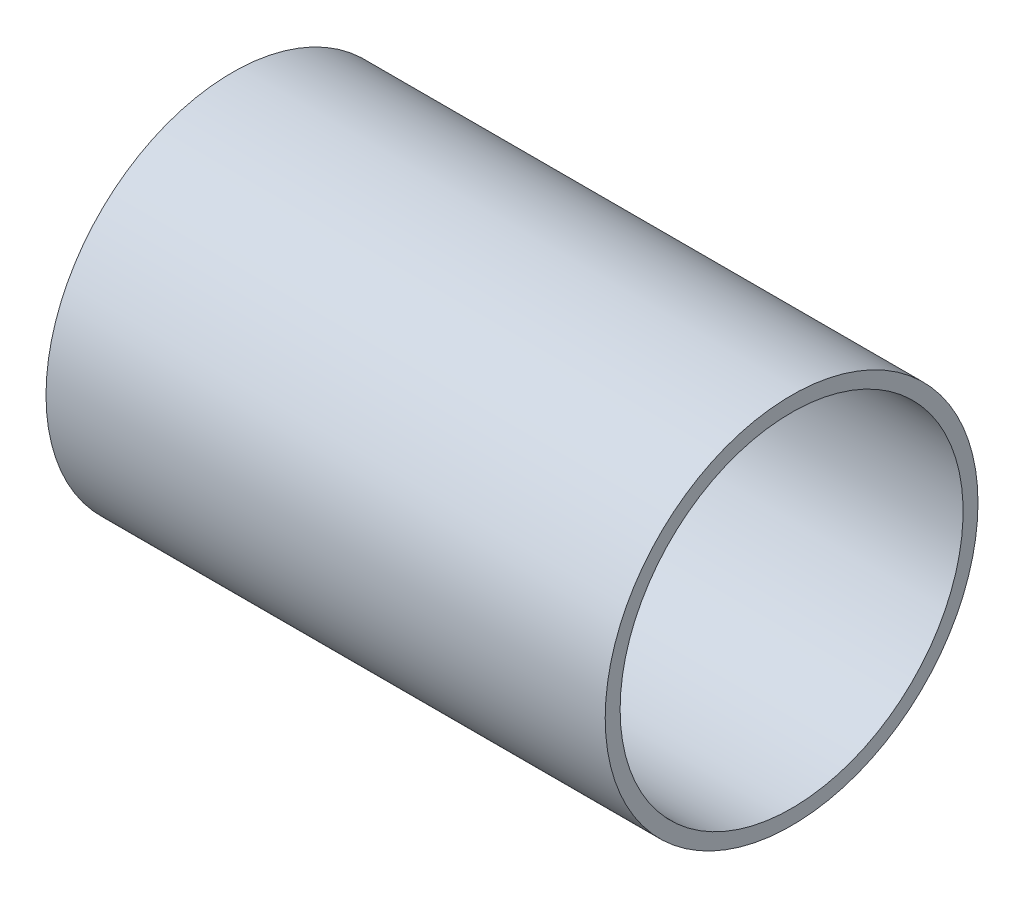
ISO-10303-21;
HEADER;
FILE_DESCRIPTION(('STEP AP214'),'2;1');
FILE_NAME('part.step','',(''),(''),'','','');
FILE_SCHEMA(('AUTOMOTIVE_DESIGN { 1 0 10303 214 1 1 1 1 }'));
ENDSEC;
DATA;
#1=APPLICATION_CONTEXT('core data for automotive mechanical design processes');
#2=APPLICATION_PROTOCOL_DEFINITION('international standard','automotive_design',2000,#1);
#3=PRODUCT_CONTEXT('',#1,'mechanical');
#4=PRODUCT('Part','Part','',(#3));
#5=PRODUCT_RELATED_PRODUCT_CATEGORY('part','',(#4));
#6=PRODUCT_DEFINITION_FORMATION('','',#4);
#7=PRODUCT_DEFINITION_CONTEXT('part definition',#1,'design');
#8=PRODUCT_DEFINITION('design','',#6,#7);
#9=PRODUCT_DEFINITION_SHAPE('','',#8);
#10=(LENGTH_UNIT() NAMED_UNIT(*) SI_UNIT(.MILLI.,.METRE.));
#11=(NAMED_UNIT(*) PLANE_ANGLE_UNIT() SI_UNIT($,.RADIAN.));
#12=(NAMED_UNIT(*) SI_UNIT($,.STERADIAN.) SOLID_ANGLE_UNIT());
#13=UNCERTAINTY_MEASURE_WITH_UNIT(LENGTH_MEASURE(1.E-05),#10,'distance_accuracy_value','');
#14=(GEOMETRIC_REPRESENTATION_CONTEXT(3) GLOBAL_UNCERTAINTY_ASSIGNED_CONTEXT((#13)) GLOBAL_UNIT_ASSIGNED_CONTEXT((#10,
#11,#12)) REPRESENTATION_CONTEXT('',''));
#15=CARTESIAN_POINT('',(0.,0.,0.));
#16=DIRECTION('',(0.,0.,1.));
#17=DIRECTION('',(1.,0.,0.));
#18=AXIS2_PLACEMENT_3D('',#15,#16,#17);
#19=CARTESIAN_POINT('',(45.,0.,0.));
#20=DIRECTION('',(1.,0.,0.));
#21=DIRECTION('',(0.,0.,-1.));
#22=AXIS2_PLACEMENT_3D('',#19,#20,#21);
#23=PLANE('',#22);
#24=CARTESIAN_POINT('',(45.,0.,0.));
#25=DIRECTION('',(1.,0.,0.));
#26=DIRECTION('',(0.,0.,-1.));
#27=AXIS2_PLACEMENT_3D('',#24,#25,#26);
#28=CIRCLE('',#27,15.);
#29=CARTESIAN_POINT('',(45.,0.,15.));
#30=VERTEX_POINT('',#29);
#31=EDGE_CURVE('E10',#30,#30,#28,.T.);
#32=ORIENTED_EDGE('',*,*,#31,.T.);
#33=EDGE_LOOP('',(#32));
#34=FACE_BOUND('',#33,.T.);
#35=CARTESIAN_POINT('',(45.,0.,0.));
#36=DIRECTION('',(1.,0.,0.));
#37=DIRECTION('',(0.,0.,-1.));
#38=AXIS2_PLACEMENT_3D('',#35,#36,#37);
#39=CIRCLE('',#38,13.8);
#40=CARTESIAN_POINT('',(45.,0.,13.8));
#41=VERTEX_POINT('',#40);
#42=EDGE_CURVE('E45',#41,#41,#39,.T.);
#43=ORIENTED_EDGE('',*,*,#42,.F.);
#44=EDGE_LOOP('',(#43));
#45=FACE_BOUND('',#44,.T.);
#46=ADVANCED_FACE('F34',(#34,#45),#23,.T.);
#47=CARTESIAN_POINT('',(0.,0.,0.));
#48=DIRECTION('',(1.,0.,0.));
#49=DIRECTION('',(0.,0.,-1.));
#50=AXIS2_PLACEMENT_3D('',#47,#48,#49);
#51=PLANE('',#50);
#52=CARTESIAN_POINT('',(0.,0.,0.));
#53=DIRECTION('',(1.,0.,0.));
#54=DIRECTION('',(0.,0.,-1.));
#55=AXIS2_PLACEMENT_3D('',#52,#53,#54);
#56=CIRCLE('',#55,15.);
#57=CARTESIAN_POINT('',(0.,0.,15.));
#58=VERTEX_POINT('',#57);
#59=EDGE_CURVE('E38',#58,#58,#56,.T.);
#60=ORIENTED_EDGE('',*,*,#59,.F.);
#61=EDGE_LOOP('',(#60));
#62=FACE_BOUND('',#61,.T.);
#63=CARTESIAN_POINT('',(0.,0.,0.));
#64=DIRECTION('',(1.,0.,0.));
#65=DIRECTION('',(0.,0.,-1.));
#66=AXIS2_PLACEMENT_3D('',#63,#64,#65);
#67=CIRCLE('',#66,13.8);
#68=CARTESIAN_POINT('',(0.,0.,13.8));
#69=VERTEX_POINT('',#68);
#70=EDGE_CURVE('E47',#69,#69,#67,.T.);
#71=ORIENTED_EDGE('',*,*,#70,.T.);
#72=EDGE_LOOP('',(#71));
#73=FACE_BOUND('',#72,.T.);
#74=ADVANCED_FACE('F57',(#62,#73),#51,.F.);
#75=CARTESIAN_POINT('',(45.,0.,0.));
#76=DIRECTION('',(-1.,0.,0.));
#77=DIRECTION('',(0.,0.,1.));
#78=AXIS2_PLACEMENT_3D('',#75,#76,#77);
#79=CYLINDRICAL_SURFACE('',#78,15.);
#80=CARTESIAN_POINT('',(45.,0.,15.));
#81=CARTESIAN_POINT('',(44.53125,0.,15.));
#82=CARTESIAN_POINT('',(44.0625,0.,15.));
#83=CARTESIAN_POINT('',(43.125,0.,15.));
#84=CARTESIAN_POINT('',(42.65625,0.,15.));
#85=CARTESIAN_POINT('',(41.71875,0.,15.));
#86=CARTESIAN_POINT('',(41.25,0.,15.));
#87=CARTESIAN_POINT('',(40.3125,0.,15.));
#88=CARTESIAN_POINT('',(39.84375,0.,15.));
#89=CARTESIAN_POINT('',(38.90625,0.,15.));
#90=CARTESIAN_POINT('',(38.4375,0.,15.));
#91=CARTESIAN_POINT('',(37.5,0.,15.));
#92=CARTESIAN_POINT('',(37.03125,0.,15.));
#93=CARTESIAN_POINT('',(36.09375,0.,15.));
#94=CARTESIAN_POINT('',(35.625,0.,15.));
#95=CARTESIAN_POINT('',(34.6875,0.,15.));
#96=CARTESIAN_POINT('',(34.21875,0.,15.));
#97=CARTESIAN_POINT('',(33.28125,0.,15.));
#98=CARTESIAN_POINT('',(32.8125,0.,15.));
#99=CARTESIAN_POINT('',(31.875,0.,15.));
#100=CARTESIAN_POINT('',(31.40625,0.,15.));
#101=CARTESIAN_POINT('',(30.46875,0.,15.));
#102=CARTESIAN_POINT('',(30.,0.,15.));
#103=CARTESIAN_POINT('',(29.0625,0.,15.));
#104=CARTESIAN_POINT('',(28.59375,0.,15.));
#105=CARTESIAN_POINT('',(27.65625,0.,15.));
#106=CARTESIAN_POINT('',(27.1875,0.,15.));
#107=CARTESIAN_POINT('',(26.25,0.,15.));
#108=CARTESIAN_POINT('',(25.78125,0.,15.));
#109=CARTESIAN_POINT('',(24.84375,0.,15.));
#110=CARTESIAN_POINT('',(24.375,0.,15.));
#111=CARTESIAN_POINT('',(23.4375,0.,15.));
#112=CARTESIAN_POINT('',(22.96875,0.,15.));
#113=CARTESIAN_POINT('',(22.03125,0.,15.));
#114=CARTESIAN_POINT('',(21.5625,0.,15.));
#115=CARTESIAN_POINT('',(20.625,0.,15.));
#116=CARTESIAN_POINT('',(20.15625,0.,15.));
#117=CARTESIAN_POINT('',(19.21875,0.,15.));
#118=CARTESIAN_POINT('',(18.75,0.,15.));
#119=CARTESIAN_POINT('',(17.8125,0.,15.));
#120=CARTESIAN_POINT('',(17.34375,0.,15.));
#121=CARTESIAN_POINT('',(16.40625,0.,15.));
#122=CARTESIAN_POINT('',(15.9375,0.,15.));
#123=CARTESIAN_POINT('',(15.,0.,15.));
#124=CARTESIAN_POINT('',(14.53125,0.,15.));
#125=CARTESIAN_POINT('',(13.59375,0.,15.));
#126=CARTESIAN_POINT('',(13.125,0.,15.));
#127=CARTESIAN_POINT('',(12.1875,0.,15.));
#128=CARTESIAN_POINT('',(11.71875,0.,15.));
#129=CARTESIAN_POINT('',(10.78125,0.,15.));
#130=CARTESIAN_POINT('',(10.3125,0.,15.));
#131=CARTESIAN_POINT('',(9.37499999999999,0.,15.));
#132=CARTESIAN_POINT('',(8.90624999999999,0.,15.));
#133=CARTESIAN_POINT('',(7.96874999999999,0.,15.));
#134=CARTESIAN_POINT('',(7.5,0.,15.));
#135=CARTESIAN_POINT('',(6.56249999999999,0.,15.));
#136=CARTESIAN_POINT('',(6.09374999999999,0.,15.));
#137=CARTESIAN_POINT('',(5.15624999999999,0.,15.));
#138=CARTESIAN_POINT('',(4.68749999999999,0.,15.));
#139=CARTESIAN_POINT('',(3.74999999999999,0.,15.));
#140=CARTESIAN_POINT('',(3.28124999999999,0.,15.));
#141=CARTESIAN_POINT('',(2.34374999999999,0.,15.));
#142=CARTESIAN_POINT('',(1.87499999999999,0.,15.));
#143=CARTESIAN_POINT('',(0.937499999999992,0.,15.));
#144=CARTESIAN_POINT('',(0.468749999999993,0.,15.));
#145=CARTESIAN_POINT('',(0.,0.,15.));
#146=B_SPLINE_CURVE_WITH_KNOTS('',3,(#80,#81,#82,#83,#84,#85,#86,#87,#88,#89,#90,#91,#92,#93,
#94,#95,#96,#97,#98,#99,#100,#101,#102,#103,#104,#105,#106,#107,#108,#109,#110,#111,#112,#113,
#114,#115,#116,#117,#118,#119,#120,#121,#122,#123,#124,#125,#126,#127,#128,#129,#130,#131,#132,
#133,#134,#135,#136,#137,#138,#139,#140,#141,#142,#143,#144,#145),.UNSPECIFIED.,.F.,.F.,(4,2,2,
2,2,2,2,2,2,2,2,2,2,2,2,2,2,2,2,2,2,2,2,2,2,2,2,2,2,2,2,2,4),(0.,1.40625,2.8125,
4.21874999999999,5.625,7.03125,8.43749999999999,9.84375,11.25,12.65625,14.0625,15.46875,16.875,
18.28125,19.6875,21.09375,22.5,23.90625,25.3125,26.71875,28.125,29.53125,30.9375,32.34375,33.75,
35.15625,36.5625,37.96875,39.375,40.78125,42.1875,43.59375,45.),.UNSPECIFIED.);
#147=EDGE_CURVE('BSEAM36',#30,#58,#146,.T.);
#148=ORIENTED_EDGE('',*,*,#31,.F.);
#149=ORIENTED_EDGE('',*,*,#59,.T.);
#150=ORIENTED_EDGE('',*,*,#147,.T.);
#151=ORIENTED_EDGE('',*,*,#147,.F.);
#152=EDGE_LOOP('',(#148,#150,#149,#151));
#153=FACE_BOUND('',#152,.T.);
#154=ADVANCED_FACE('F36',(#153),#79,.T.);
#155=CARTESIAN_POINT('',(45.,0.,0.));
#156=DIRECTION('',(-1.,0.,0.));
#157=DIRECTION('',(0.,0.,1.));
#158=AXIS2_PLACEMENT_3D('',#155,#156,#157);
#159=CYLINDRICAL_SURFACE('',#158,13.8);
#160=CARTESIAN_POINT('',(45.,0.,13.8));
#161=CARTESIAN_POINT('',(44.53125,0.,13.8));
#162=CARTESIAN_POINT('',(44.0625,0.,13.8));
#163=CARTESIAN_POINT('',(43.125,0.,13.8));
#164=CARTESIAN_POINT('',(42.65625,0.,13.8));
#165=CARTESIAN_POINT('',(41.71875,0.,13.8));
#166=CARTESIAN_POINT('',(41.25,0.,13.8));
#167=CARTESIAN_POINT('',(40.3125,0.,13.8));
#168=CARTESIAN_POINT('',(39.84375,0.,13.8));
#169=CARTESIAN_POINT('',(38.90625,0.,13.8));
#170=CARTESIAN_POINT('',(38.4375,0.,13.8));
#171=CARTESIAN_POINT('',(37.5,0.,13.8));
#172=CARTESIAN_POINT('',(37.03125,0.,13.8));
#173=CARTESIAN_POINT('',(36.09375,0.,13.8));
#174=CARTESIAN_POINT('',(35.625,0.,13.8));
#175=CARTESIAN_POINT('',(34.6875,0.,13.8));
#176=CARTESIAN_POINT('',(34.21875,0.,13.8));
#177=CARTESIAN_POINT('',(33.28125,0.,13.8));
#178=CARTESIAN_POINT('',(32.8125,0.,13.8));
#179=CARTESIAN_POINT('',(31.875,0.,13.8));
#180=CARTESIAN_POINT('',(31.40625,0.,13.8));
#181=CARTESIAN_POINT('',(30.46875,0.,13.8));
#182=CARTESIAN_POINT('',(30.,0.,13.8));
#183=CARTESIAN_POINT('',(29.0625,0.,13.8));
#184=CARTESIAN_POINT('',(28.59375,0.,13.8));
#185=CARTESIAN_POINT('',(27.65625,0.,13.8));
#186=CARTESIAN_POINT('',(27.1875,0.,13.8));
#187=CARTESIAN_POINT('',(26.25,0.,13.8));
#188=CARTESIAN_POINT('',(25.78125,0.,13.8));
#189=CARTESIAN_POINT('',(24.84375,0.,13.8));
#190=CARTESIAN_POINT('',(24.375,0.,13.8));
#191=CARTESIAN_POINT('',(23.4375,0.,13.8));
#192=CARTESIAN_POINT('',(22.96875,0.,13.8));
#193=CARTESIAN_POINT('',(22.03125,0.,13.8));
#194=CARTESIAN_POINT('',(21.5625,0.,13.8));
#195=CARTESIAN_POINT('',(20.625,0.,13.8));
#196=CARTESIAN_POINT('',(20.15625,0.,13.8));
#197=CARTESIAN_POINT('',(19.21875,0.,13.8));
#198=CARTESIAN_POINT('',(18.75,0.,13.8));
#199=CARTESIAN_POINT('',(17.8125,0.,13.8));
#200=CARTESIAN_POINT('',(17.34375,0.,13.8));
#201=CARTESIAN_POINT('',(16.40625,0.,13.8));
#202=CARTESIAN_POINT('',(15.9375,0.,13.8));
#203=CARTESIAN_POINT('',(15.,0.,13.8));
#204=CARTESIAN_POINT('',(14.53125,0.,13.8));
#205=CARTESIAN_POINT('',(13.59375,0.,13.8));
#206=CARTESIAN_POINT('',(13.125,0.,13.8));
#207=CARTESIAN_POINT('',(12.1875,0.,13.8));
#208=CARTESIAN_POINT('',(11.71875,0.,13.8));
#209=CARTESIAN_POINT('',(10.78125,0.,13.8));
#210=CARTESIAN_POINT('',(10.3125,0.,13.8));
#211=CARTESIAN_POINT('',(9.375,0.,13.8));
#212=CARTESIAN_POINT('',(8.90625,0.,13.8));
#213=CARTESIAN_POINT('',(7.96874999999999,0.,13.8));
#214=CARTESIAN_POINT('',(7.5,0.,13.8));
#215=CARTESIAN_POINT('',(6.5625,0.,13.8));
#216=CARTESIAN_POINT('',(6.09375,0.,13.8));
#217=CARTESIAN_POINT('',(5.15625,0.,13.8));
#218=CARTESIAN_POINT('',(4.68749999999999,0.,13.8));
#219=CARTESIAN_POINT('',(3.74999999999999,0.,13.8));
#220=CARTESIAN_POINT('',(3.28124999999999,0.,13.8));
#221=CARTESIAN_POINT('',(2.34374999999999,0.,13.8));
#222=CARTESIAN_POINT('',(1.87499999999999,0.,13.8));
#223=CARTESIAN_POINT('',(0.937499999999992,0.,13.8));
#224=CARTESIAN_POINT('',(0.468749999999993,0.,13.8));
#225=CARTESIAN_POINT('',(0.,0.,13.8));
#226=B_SPLINE_CURVE_WITH_KNOTS('',3,(#160,#161,#162,#163,#164,#165,#166,#167,#168,#169,#170,
#171,#172,#173,#174,#175,#176,#177,#178,#179,#180,#181,#182,#183,#184,#185,#186,#187,#188,#189,
#190,#191,#192,#193,#194,#195,#196,#197,#198,#199,#200,#201,#202,#203,#204,#205,#206,#207,#208,
#209,#210,#211,#212,#213,#214,#215,#216,#217,#218,#219,#220,#221,#222,#223,#224,#225),
.UNSPECIFIED.,.F.,.F.,(4,2,2,2,2,2,2,2,2,2,2,2,2,2,2,2,2,2,2,2,2,2,2,2,2,2,2,2,2,2,2,2,4),(0.,
1.40625,2.8125,4.21875000000001,5.62500000000001,7.03125,8.4375,9.84375000000001,11.25,12.65625,
14.0625,15.46875,16.875,18.28125,19.6875,21.09375,22.5,23.90625,25.3125,26.71875,28.125,
29.53125,30.9375,32.34375,33.75,35.15625,36.5625,37.96875,39.375,40.78125,42.1875,43.59375,45.),.UNSPECIFIED.);
#227=EDGE_CURVE('BSEAM53',#41,#69,#226,.T.);
#228=ORIENTED_EDGE('',*,*,#42,.T.);
#229=ORIENTED_EDGE('',*,*,#70,.F.);
#230=ORIENTED_EDGE('',*,*,#227,.T.);
#231=ORIENTED_EDGE('',*,*,#227,.F.);
#232=EDGE_LOOP('',(#228,#230,#229,#231));
#233=FACE_BOUND('',#232,.T.);
#234=ADVANCED_FACE('F53',(#233),#159,.F.);
#235=CLOSED_SHELL('',(#46,#74,#154,#234));
#236=MANIFOLD_SOLID_BREP('B2',#235);
#237=ADVANCED_BREP_SHAPE_REPRESENTATION('',(#18,#236),#14);
#238=SHAPE_DEFINITION_REPRESENTATION(#9,#237);
ENDSEC;
END-ISO-10303-21;
